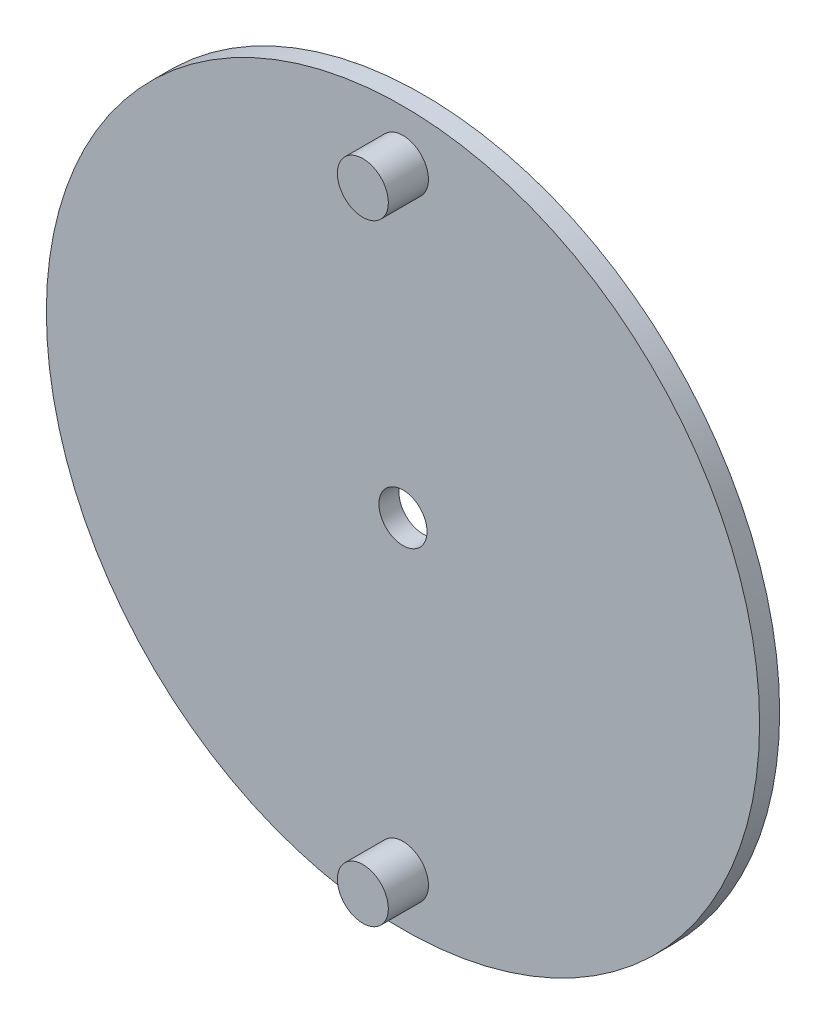
ISO-10303-21;
HEADER;
FILE_DESCRIPTION(('STEP AP214'),'2;1');
FILE_NAME('part.step','',(''),(''),'','','');
FILE_SCHEMA(('AUTOMOTIVE_DESIGN { 1 0 10303 214 1 1 1 1 }'));
ENDSEC;
DATA;
#1=APPLICATION_CONTEXT('core data for automotive mechanical design processes');
#2=APPLICATION_PROTOCOL_DEFINITION('international standard','automotive_design',2000,#1);
#3=PRODUCT_CONTEXT('',#1,'mechanical');
#4=PRODUCT('Part','Part','',(#3));
#5=PRODUCT_RELATED_PRODUCT_CATEGORY('part','',(#4));
#6=PRODUCT_DEFINITION_FORMATION('','',#4);
#7=PRODUCT_DEFINITION_CONTEXT('part definition',#1,'design');
#8=PRODUCT_DEFINITION('design','',#6,#7);
#9=PRODUCT_DEFINITION_SHAPE('','',#8);
#10=(LENGTH_UNIT() NAMED_UNIT(*) SI_UNIT(.MILLI.,.METRE.));
#11=(NAMED_UNIT(*) PLANE_ANGLE_UNIT() SI_UNIT($,.RADIAN.));
#12=(NAMED_UNIT(*) SI_UNIT($,.STERADIAN.) SOLID_ANGLE_UNIT());
#13=UNCERTAINTY_MEASURE_WITH_UNIT(LENGTH_MEASURE(1.E-05),#10,'distance_accuracy_value','');
#14=(GEOMETRIC_REPRESENTATION_CONTEXT(3) GLOBAL_UNCERTAINTY_ASSIGNED_CONTEXT((#13)) GLOBAL_UNIT_ASSIGNED_CONTEXT((#10,
#11,#12)) REPRESENTATION_CONTEXT('',''));
#15=CARTESIAN_POINT('',(0.,0.,0.));
#16=DIRECTION('',(0.,0.,1.));
#17=DIRECTION('',(1.,0.,0.));
#18=AXIS2_PLACEMENT_3D('',#15,#16,#17);
#19=CARTESIAN_POINT('',(0.,0.,5.));
#20=DIRECTION('',(0.,0.,1.));
#21=DIRECTION('',(1.,0.,0.));
#22=AXIS2_PLACEMENT_3D('',#19,#20,#21);
#23=PLANE('',#22);
#24=CARTESIAN_POINT('',(0.,-76.2,5.));
#25=DIRECTION('',(0.,0.,1.));
#26=DIRECTION('',(1.,0.,0.));
#27=AXIS2_PLACEMENT_3D('',#24,#25,#26);
#28=CIRCLE('',#27,6.34999999999999);
#29=CARTESIAN_POINT('',(6.34999999999999,-76.2,5.));
#30=VERTEX_POINT('',#29);
#31=EDGE_CURVE('E60',#30,#30,#28,.T.);
#32=ORIENTED_EDGE('',*,*,#31,.F.);
#33=EDGE_LOOP('',(#32));
#34=FACE_BOUND('',#33,.T.);
#35=CARTESIAN_POINT('',(0.,0.,5.));
#36=DIRECTION('',(0.,0.,1.));
#37=DIRECTION('',(1.,0.,0.));
#38=AXIS2_PLACEMENT_3D('',#35,#36,#37);
#39=CIRCLE('',#38,88.9);
#40=CARTESIAN_POINT('',(88.9,0.,5.));
#41=VERTEX_POINT('',#40);
#42=EDGE_CURVE('E10',#41,#41,#39,.T.);
#43=ORIENTED_EDGE('',*,*,#42,.T.);
#44=EDGE_LOOP('',(#43));
#45=FACE_BOUND('',#44,.T.);
#46=CARTESIAN_POINT('',(0.,0.,5.));
#47=DIRECTION('',(0.,0.,1.));
#48=DIRECTION('',(1.,0.,0.));
#49=AXIS2_PLACEMENT_3D('',#46,#47,#48);
#50=CIRCLE('',#49,6.);
#51=CARTESIAN_POINT('',(6.,0.,5.));
#52=VERTEX_POINT('',#51);
#53=EDGE_CURVE('E54',#52,#52,#50,.T.);
#54=ORIENTED_EDGE('',*,*,#53,.F.);
#55=EDGE_LOOP('',(#54));
#56=FACE_BOUND('',#55,.T.);
#57=CARTESIAN_POINT('',(0.,76.2,5.));
#58=DIRECTION('',(0.,0.,1.));
#59=DIRECTION('',(1.,0.,0.));
#60=AXIS2_PLACEMENT_3D('',#57,#58,#59);
#61=CIRCLE('',#60,6.35);
#62=CARTESIAN_POINT('',(6.35,76.2,5.));
#63=VERTEX_POINT('',#62);
#64=EDGE_CURVE('E67',#63,#63,#61,.T.);
#65=ORIENTED_EDGE('',*,*,#64,.F.);
#66=EDGE_LOOP('',(#65));
#67=FACE_BOUND('',#66,.T.);
#68=ADVANCED_FACE('F41',(#34,#45,#56,#67),#23,.T.);
#69=CARTESIAN_POINT('',(0.,0.,0.));
#70=DIRECTION('',(0.,0.,1.));
#71=DIRECTION('',(1.,0.,0.));
#72=AXIS2_PLACEMENT_3D('',#69,#70,#71);
#73=PLANE('',#72);
#74=CARTESIAN_POINT('',(0.,0.,0.));
#75=DIRECTION('',(0.,0.,1.));
#76=DIRECTION('',(1.,0.,0.));
#77=AXIS2_PLACEMENT_3D('',#74,#75,#76);
#78=CIRCLE('',#77,88.9);
#79=CARTESIAN_POINT('',(88.9,0.,0.));
#80=VERTEX_POINT('',#79);
#81=EDGE_CURVE('E45',#80,#80,#78,.T.);
#82=ORIENTED_EDGE('',*,*,#81,.F.);
#83=EDGE_LOOP('',(#82));
#84=FACE_BOUND('',#83,.T.);
#85=CARTESIAN_POINT('',(0.,0.,0.));
#86=DIRECTION('',(0.,0.,1.));
#87=DIRECTION('',(1.,0.,0.));
#88=AXIS2_PLACEMENT_3D('',#85,#86,#87);
#89=CIRCLE('',#88,6.);
#90=CARTESIAN_POINT('',(6.,0.,0.));
#91=VERTEX_POINT('',#90);
#92=EDGE_CURVE('E56',#91,#91,#89,.T.);
#93=ORIENTED_EDGE('',*,*,#92,.T.);
#94=EDGE_LOOP('',(#93));
#95=FACE_BOUND('',#94,.T.);
#96=ADVANCED_FACE('F96',(#84,#95),#73,.F.);
#97=CARTESIAN_POINT('',(0.,0.,5.));
#98=DIRECTION('',(0.,0.,-1.));
#99=DIRECTION('',(-1.,0.,0.));
#100=AXIS2_PLACEMENT_3D('',#97,#98,#99);
#101=CYLINDRICAL_SURFACE('',#100,88.9);
#102=ORIENTED_EDGE('',*,*,#42,.F.);
#103=EDGE_LOOP('',(#102));
#104=FACE_BOUND('',#103,.T.);
#105=ORIENTED_EDGE('',*,*,#81,.T.);
#106=EDGE_LOOP('',(#105));
#107=FACE_BOUND('',#106,.T.);
#108=ADVANCED_FACE('F43',(#104,#107),#101,.T.);
#109=CARTESIAN_POINT('',(0.,0.,5.));
#110=DIRECTION('',(0.,0.,-1.));
#111=DIRECTION('',(-1.,0.,0.));
#112=AXIS2_PLACEMENT_3D('',#109,#110,#111);
#113=CYLINDRICAL_SURFACE('',#112,6.);
#114=ORIENTED_EDGE('',*,*,#53,.T.);
#115=EDGE_LOOP('',(#114));
#116=FACE_BOUND('',#115,.T.);
#117=ORIENTED_EDGE('',*,*,#92,.F.);
#118=EDGE_LOOP('',(#117));
#119=FACE_BOUND('',#118,.T.);
#120=ADVANCED_FACE('F105',(#116,#119),#113,.F.);
#121=CARTESIAN_POINT('',(0.,-76.2,15.));
#122=DIRECTION('',(0.,0.,-1.));
#123=DIRECTION('',(-1.,0.,0.));
#124=AXIS2_PLACEMENT_3D('',#121,#122,#123);
#125=CYLINDRICAL_SURFACE('',#124,6.34999999999999);
#126=ORIENTED_EDGE('',*,*,#31,.T.);
#127=EDGE_LOOP('',(#126));
#128=FACE_BOUND('',#127,.T.);
#129=CARTESIAN_POINT('',(0.,-76.2,15.));
#130=DIRECTION('',(0.,0.,1.));
#131=DIRECTION('',(1.,0.,0.));
#132=AXIS2_PLACEMENT_3D('',#129,#130,#131);
#133=CIRCLE('',#132,6.34999999999999);
#134=CARTESIAN_POINT('',(6.34999999999999,-76.2,15.));
#135=VERTEX_POINT('',#134);
#136=EDGE_CURVE('E71',#135,#135,#133,.T.);
#137=ORIENTED_EDGE('',*,*,#136,.F.);
#138=EDGE_LOOP('',(#137));
#139=FACE_BOUND('',#138,.T.);
#140=ADVANCED_FACE('F92',(#128,#139),#125,.T.);
#141=CARTESIAN_POINT('',(0.,-76.2,15.));
#142=DIRECTION('',(0.,0.,1.));
#143=DIRECTION('',(1.,0.,0.));
#144=AXIS2_PLACEMENT_3D('',#141,#142,#143);
#145=PLANE('',#144);
#146=ORIENTED_EDGE('',*,*,#136,.T.);
#147=EDGE_LOOP('',(#146));
#148=FACE_BOUND('',#147,.T.);
#149=ADVANCED_FACE('F84',(#148),#145,.T.);
#150=CARTESIAN_POINT('',(0.,76.2,15.));
#151=DIRECTION('',(0.,0.,-1.));
#152=DIRECTION('',(-1.,0.,0.));
#153=AXIS2_PLACEMENT_3D('',#150,#151,#152);
#154=CYLINDRICAL_SURFACE('',#153,6.34999999999999);
#155=ORIENTED_EDGE('',*,*,#64,.T.);
#156=EDGE_LOOP('',(#155));
#157=FACE_BOUND('',#156,.T.);
#158=CARTESIAN_POINT('',(0.,76.2,15.));
#159=DIRECTION('',(0.,0.,1.));
#160=DIRECTION('',(1.,0.,0.));
#161=AXIS2_PLACEMENT_3D('',#158,#159,#160);
#162=CIRCLE('',#161,6.34999999999999);
#163=CARTESIAN_POINT('',(6.34999999999999,76.2,15.));
#164=VERTEX_POINT('',#163);
#165=EDGE_CURVE('E75',#164,#164,#162,.T.);
#166=ORIENTED_EDGE('',*,*,#165,.F.);
#167=EDGE_LOOP('',(#166));
#168=FACE_BOUND('',#167,.T.);
#169=ADVANCED_FACE('F82',(#157,#168),#154,.T.);
#170=CARTESIAN_POINT('',(0.,76.2,15.));
#171=DIRECTION('',(0.,0.,1.));
#172=DIRECTION('',(1.,0.,0.));
#173=AXIS2_PLACEMENT_3D('',#170,#171,#172);
#174=PLANE('',#173);
#175=ORIENTED_EDGE('',*,*,#165,.T.);
#176=EDGE_LOOP('',(#175));
#177=FACE_BOUND('',#176,.T.);
#178=ADVANCED_FACE('F80',(#177),#174,.T.);
#179=CLOSED_SHELL('',(#68,#96,#108,#120,#140,#149,#169,#178));
#180=MANIFOLD_SOLID_BREP('B2',#179);
#181=ADVANCED_BREP_SHAPE_REPRESENTATION('',(#18,#180),#14);
#182=SHAPE_DEFINITION_REPRESENTATION(#9,#181);
ENDSEC;
END-ISO-10303-21;
